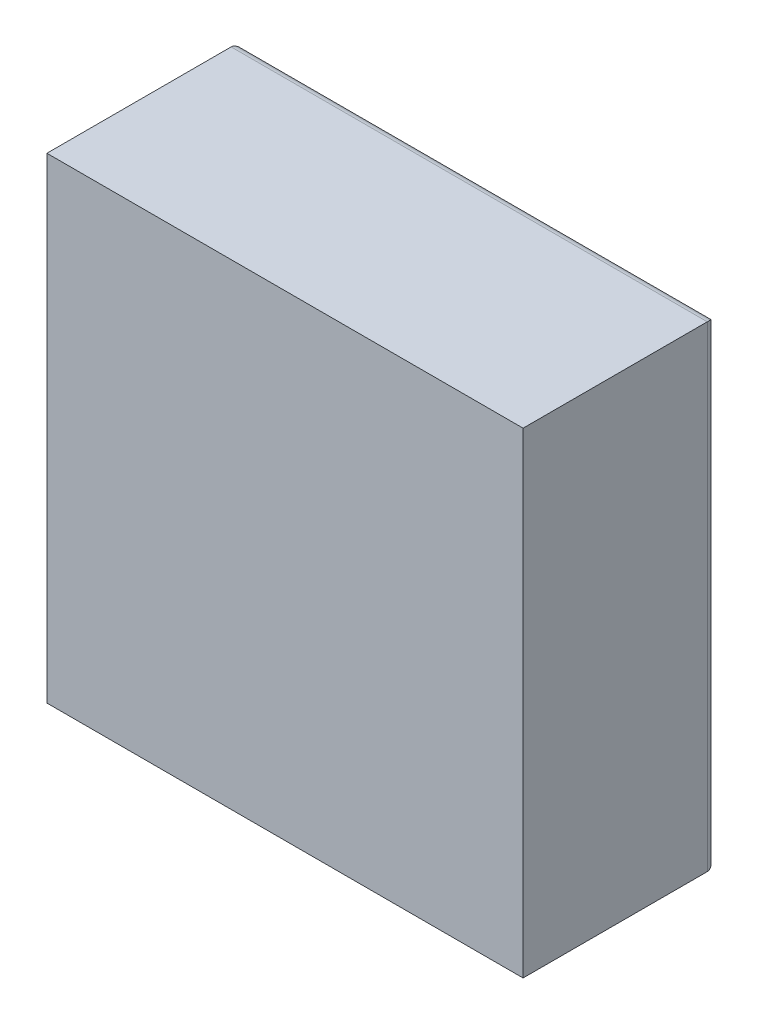
ISO-10303-21;
HEADER;
FILE_DESCRIPTION(('STEP AP214'),'2;1');
FILE_NAME('part.step','',(''),(''),'','','');
FILE_SCHEMA(('AUTOMOTIVE_DESIGN { 1 0 10303 214 1 1 1 1 }'));
ENDSEC;
DATA;
#1=APPLICATION_CONTEXT('core data for automotive mechanical design processes');
#2=APPLICATION_PROTOCOL_DEFINITION('international standard','automotive_design',2000,#1);
#3=PRODUCT_CONTEXT('',#1,'mechanical');
#4=PRODUCT('Part','Part','',(#3));
#5=PRODUCT_RELATED_PRODUCT_CATEGORY('part','',(#4));
#6=PRODUCT_DEFINITION_FORMATION('','',#4);
#7=PRODUCT_DEFINITION_CONTEXT('part definition',#1,'design');
#8=PRODUCT_DEFINITION('design','',#6,#7);
#9=PRODUCT_DEFINITION_SHAPE('','',#8);
#10=(LENGTH_UNIT() NAMED_UNIT(*) SI_UNIT(.MILLI.,.METRE.));
#11=(NAMED_UNIT(*) PLANE_ANGLE_UNIT() SI_UNIT($,.RADIAN.));
#12=(NAMED_UNIT(*) SI_UNIT($,.STERADIAN.) SOLID_ANGLE_UNIT());
#13=UNCERTAINTY_MEASURE_WITH_UNIT(LENGTH_MEASURE(1.E-05),#10,'distance_accuracy_value','');
#14=(GEOMETRIC_REPRESENTATION_CONTEXT(3) GLOBAL_UNCERTAINTY_ASSIGNED_CONTEXT((#13)) GLOBAL_UNIT_ASSIGNED_CONTEXT((#10,
#11,#12)) REPRESENTATION_CONTEXT('',''));
#15=CARTESIAN_POINT('',(0.,0.,0.));
#16=DIRECTION('',(0.,0.,1.));
#17=DIRECTION('',(1.,0.,0.));
#18=AXIS2_PLACEMENT_3D('',#15,#16,#17);
#19=CARTESIAN_POINT('',(-252.,252.,205.));
#20=DIRECTION('',(1.,0.,0.));
#21=DIRECTION('',(0.,0.,-1.));
#22=AXIS2_PLACEMENT_3D('',#19,#20,#21);
#23=PLANE('',#22);
#24=DIRECTION('',(0.,0.,-1.));
#25=VECTOR('',#24,1.);
#26=CARTESIAN_POINT('',(-252.,252.,205.));
#27=LINE('',#26,#25);
#28=CARTESIAN_POINT('',(-252.,252.,205.));
#29=VERTEX_POINT('',#28);
#30=CARTESIAN_POINT('',(-252.,252.,10.0000000000001));
#31=VERTEX_POINT('',#30);
#32=EDGE_CURVE('E391',#29,#31,#27,.T.);
#33=ORIENTED_EDGE('',*,*,#32,.T.);
#34=DIRECTION('',(0.,-1.,0.));
#35=VECTOR('',#34,1.);
#36=CARTESIAN_POINT('',(-252.,-252.,10.));
#37=LINE('',#36,#35);
#38=CARTESIAN_POINT('',(-252.,-252.,10.0000000000001));
#39=VERTEX_POINT('',#38);
#40=EDGE_CURVE('E149',#31,#39,#37,.T.);
#41=ORIENTED_EDGE('',*,*,#40,.T.);
#42=DIRECTION('',(0.,0.,-1.));
#43=VECTOR('',#42,1.);
#44=CARTESIAN_POINT('',(-252.,-252.,205.));
#45=LINE('',#44,#43);
#46=CARTESIAN_POINT('',(-252.,-252.,205.));
#47=VERTEX_POINT('',#46);
#48=EDGE_CURVE('E130',#47,#39,#45,.T.);
#49=ORIENTED_EDGE('',*,*,#48,.F.);
#50=DIRECTION('',(0.,-1.,0.));
#51=VECTOR('',#50,1.);
#52=CARTESIAN_POINT('',(-252.,252.,205.));
#53=LINE('',#52,#51);
#54=EDGE_CURVE('E137',#29,#47,#53,.T.);
#55=ORIENTED_EDGE('',*,*,#54,.F.);
#56=EDGE_LOOP('',(#33,#41,#49,#55));
#57=FACE_BOUND('',#56,.T.);
#58=ADVANCED_FACE('F37',(#57),#23,.F.);
#59=CARTESIAN_POINT('',(252.,-252.,205.));
#60=DIRECTION('',(0.,1.,0.));
#61=DIRECTION('',(0.,0.,1.));
#62=AXIS2_PLACEMENT_3D('',#59,#60,#61);
#63=PLANE('',#62);
#64=ORIENTED_EDGE('',*,*,#48,.T.);
#65=DIRECTION('',(1.,0.,0.));
#66=VECTOR('',#65,1.);
#67=CARTESIAN_POINT('',(252.,-252.,10.));
#68=LINE('',#67,#66);
#69=CARTESIAN_POINT('',(252.,-252.,10.0000000000001));
#70=VERTEX_POINT('',#69);
#71=EDGE_CURVE('E150',#39,#70,#68,.T.);
#72=ORIENTED_EDGE('',*,*,#71,.T.);
#73=DIRECTION('',(0.,0.,-1.));
#74=VECTOR('',#73,1.);
#75=CARTESIAN_POINT('',(252.,-252.,205.));
#76=LINE('',#75,#74);
#77=CARTESIAN_POINT('',(252.,-252.,205.));
#78=VERTEX_POINT('',#77);
#79=EDGE_CURVE('E133',#78,#70,#76,.T.);
#80=ORIENTED_EDGE('',*,*,#79,.F.);
#81=DIRECTION('',(1.,0.,0.));
#82=VECTOR('',#81,1.);
#83=CARTESIAN_POINT('',(252.,-252.,205.));
#84=LINE('',#83,#82);
#85=EDGE_CURVE('E125',#47,#78,#84,.T.);
#86=ORIENTED_EDGE('',*,*,#85,.F.);
#87=EDGE_LOOP('',(#64,#72,#80,#86));
#88=FACE_BOUND('',#87,.T.);
#89=ADVANCED_FACE('F127',(#88),#63,.F.);
#90=CARTESIAN_POINT('',(252.,252.,205.));
#91=DIRECTION('',(-1.,0.,0.));
#92=DIRECTION('',(0.,0.,1.));
#93=AXIS2_PLACEMENT_3D('',#90,#91,#92);
#94=PLANE('',#93);
#95=ORIENTED_EDGE('',*,*,#79,.T.);
#96=DIRECTION('',(0.,1.,0.));
#97=VECTOR('',#96,1.);
#98=CARTESIAN_POINT('',(252.,252.,10.));
#99=LINE('',#98,#97);
#100=CARTESIAN_POINT('',(252.,252.,10.0000000000001));
#101=VERTEX_POINT('',#100);
#102=EDGE_CURVE('E162',#70,#101,#99,.T.);
#103=ORIENTED_EDGE('',*,*,#102,.T.);
#104=DIRECTION('',(0.,0.,-1.));
#105=VECTOR('',#104,1.);
#106=CARTESIAN_POINT('',(252.,252.,205.));
#107=LINE('',#106,#105);
#108=CARTESIAN_POINT('',(252.,252.,205.));
#109=VERTEX_POINT('',#108);
#110=EDGE_CURVE('E154',#109,#101,#107,.T.);
#111=ORIENTED_EDGE('',*,*,#110,.F.);
#112=DIRECTION('',(0.,1.,0.));
#113=VECTOR('',#112,1.);
#114=CARTESIAN_POINT('',(252.,252.,205.));
#115=LINE('',#114,#113);
#116=EDGE_CURVE('E136',#78,#109,#115,.T.);
#117=ORIENTED_EDGE('',*,*,#116,.F.);
#118=EDGE_LOOP('',(#95,#103,#111,#117));
#119=FACE_BOUND('',#118,.T.);
#120=ADVANCED_FACE('F294',(#119),#94,.F.);
#121=CARTESIAN_POINT('',(252.,252.,205.));
#122=DIRECTION('',(0.,-1.,0.));
#123=DIRECTION('',(0.,0.,-1.));
#124=AXIS2_PLACEMENT_3D('',#121,#122,#123);
#125=PLANE('',#124);
#126=ORIENTED_EDGE('',*,*,#110,.T.);
#127=DIRECTION('',(-1.,0.,0.));
#128=VECTOR('',#127,1.);
#129=CARTESIAN_POINT('',(-252.,252.,10.));
#130=LINE('',#129,#128);
#131=EDGE_CURVE('E167',#101,#31,#130,.T.);
#132=ORIENTED_EDGE('',*,*,#131,.T.);
#133=ORIENTED_EDGE('',*,*,#32,.F.);
#134=DIRECTION('',(-1.,0.,0.));
#135=VECTOR('',#134,1.);
#136=CARTESIAN_POINT('',(252.,252.,205.));
#137=LINE('',#136,#135);
#138=EDGE_CURVE('E142',#109,#29,#137,.T.);
#139=ORIENTED_EDGE('',*,*,#138,.F.);
#140=EDGE_LOOP('',(#126,#132,#133,#139));
#141=FACE_BOUND('',#140,.T.);
#142=ADVANCED_FACE('F299',(#141),#125,.F.);
#143=CARTESIAN_POINT('',(0.,0.,205.));
#144=DIRECTION('',(0.,0.,-1.));
#145=DIRECTION('',(-1.,0.,0.));
#146=AXIS2_PLACEMENT_3D('',#143,#144,#145);
#147=PLANE('',#146);
#148=ORIENTED_EDGE('',*,*,#54,.T.);
#149=ORIENTED_EDGE('',*,*,#85,.T.);
#150=ORIENTED_EDGE('',*,*,#116,.T.);
#151=ORIENTED_EDGE('',*,*,#138,.T.);
#152=EDGE_LOOP('',(#148,#149,#150,#151));
#153=FACE_BOUND('',#152,.T.);
#154=ADVANCED_FACE('F140',(#153),#147,.F.);
#155=CARTESIAN_POINT('',(-250.,250.,200.));
#156=DIRECTION('',(-1.,0.,0.));
#157=DIRECTION('',(0.,0.,1.));
#158=AXIS2_PLACEMENT_3D('',#155,#156,#157);
#159=PLANE('',#158);
#160=DIRECTION('',(0.,0.,-1.));
#161=VECTOR('',#160,1.);
#162=CARTESIAN_POINT('',(-250.,250.,200.));
#163=LINE('',#162,#161);
#164=CARTESIAN_POINT('',(-250.,250.,190.));
#165=VERTEX_POINT('',#164);
#166=CARTESIAN_POINT('',(-250.,250.,4.00000000000009));
#167=VERTEX_POINT('',#166);
#168=EDGE_CURVE('E214',#165,#167,#163,.T.);
#169=ORIENTED_EDGE('',*,*,#168,.F.);
#170=DIRECTION('',(0.,1.,0.));
#171=VECTOR('',#170,1.);
#172=CARTESIAN_POINT('',(-250.,250.,190.));
#173=LINE('',#172,#171);
#174=CARTESIAN_POINT('',(-250.,-240.,190.));
#175=VERTEX_POINT('',#174);
#176=EDGE_CURVE('E61',#165,#175,#173,.F.);
#177=ORIENTED_EDGE('',*,*,#176,.T.);
#178=DIRECTION('',(0.,0.,-1.));
#179=VECTOR('',#178,1.);
#180=CARTESIAN_POINT('',(-250.,-240.,0.));
#181=LINE('',#180,#179);
#182=CARTESIAN_POINT('',(-250.,-240.,4.00000000000009));
#183=VERTEX_POINT('',#182);
#184=EDGE_CURVE('E173',#175,#183,#181,.T.);
#185=ORIENTED_EDGE('',*,*,#184,.T.);
#186=DIRECTION('',(0.,1.,0.));
#187=VECTOR('',#186,1.);
#188=CARTESIAN_POINT('',(-250.,0.,4.00000000000009));
#189=LINE('',#188,#187);
#190=EDGE_CURVE('E175',#183,#167,#189,.T.);
#191=ORIENTED_EDGE('',*,*,#190,.T.);
#192=EDGE_LOOP('',(#169,#177,#185,#191));
#193=FACE_BOUND('',#192,.T.);
#194=ADVANCED_FACE('F272',(#193),#159,.F.);
#195=CARTESIAN_POINT('',(250.,-250.,200.));
#196=DIRECTION('',(0.,-1.,0.));
#197=DIRECTION('',(0.,0.,-1.));
#198=AXIS2_PLACEMENT_3D('',#195,#196,#197);
#199=PLANE('',#198);
#200=DIRECTION('',(0.,0.,-1.));
#201=VECTOR('',#200,1.);
#202=CARTESIAN_POINT('',(-240.,-250.,200.));
#203=LINE('',#202,#201);
#204=CARTESIAN_POINT('',(-240.,-250.,4.00000000000003));
#205=VERTEX_POINT('',#204);
#206=CARTESIAN_POINT('',(-240.,-250.,190.));
#207=VERTEX_POINT('',#206);
#208=EDGE_CURVE('E152',#205,#207,#203,.F.);
#209=ORIENTED_EDGE('',*,*,#208,.T.);
#210=DIRECTION('',(-1.,0.,0.));
#211=VECTOR('',#210,1.);
#212=CARTESIAN_POINT('',(250.,-250.,190.));
#213=LINE('',#212,#211);
#214=CARTESIAN_POINT('',(250.,-250.,190.));
#215=VERTEX_POINT('',#214);
#216=EDGE_CURVE('E11',#207,#215,#213,.F.);
#217=ORIENTED_EDGE('',*,*,#216,.T.);
#218=DIRECTION('',(0.,0.,-1.));
#219=VECTOR('',#218,1.);
#220=CARTESIAN_POINT('',(250.,-250.,200.));
#221=LINE('',#220,#219);
#222=CARTESIAN_POINT('',(250.,-250.,4.00000000000003));
#223=VERTEX_POINT('',#222);
#224=EDGE_CURVE('E146',#215,#223,#221,.T.);
#225=ORIENTED_EDGE('',*,*,#224,.T.);
#226=DIRECTION('',(-1.,0.,0.));
#227=VECTOR('',#226,1.);
#228=CARTESIAN_POINT('',(0.,-250.,4.00000000000002));
#229=LINE('',#228,#227);
#230=EDGE_CURVE('E159',#223,#205,#229,.T.);
#231=ORIENTED_EDGE('',*,*,#230,.T.);
#232=EDGE_LOOP('',(#209,#217,#225,#231));
#233=FACE_BOUND('',#232,.T.);
#234=ADVANCED_FACE('F256',(#233),#199,.F.);
#235=CARTESIAN_POINT('',(250.,250.,200.));
#236=DIRECTION('',(1.,0.,0.));
#237=DIRECTION('',(0.,0.,-1.));
#238=AXIS2_PLACEMENT_3D('',#235,#236,#237);
#239=PLANE('',#238);
#240=ORIENTED_EDGE('',*,*,#224,.F.);
#241=DIRECTION('',(0.,-1.,0.));
#242=VECTOR('',#241,1.);
#243=CARTESIAN_POINT('',(250.,250.,190.));
#244=LINE('',#243,#242);
#245=CARTESIAN_POINT('',(250.,250.,190.));
#246=VERTEX_POINT('',#245);
#247=EDGE_CURVE('E223',#215,#246,#244,.F.);
#248=ORIENTED_EDGE('',*,*,#247,.T.);
#249=DIRECTION('',(0.,0.,-1.));
#250=VECTOR('',#249,1.);
#251=CARTESIAN_POINT('',(250.,250.,200.));
#252=LINE('',#251,#250);
#253=CARTESIAN_POINT('',(250.,250.,4.00000000000003));
#254=VERTEX_POINT('',#253);
#255=EDGE_CURVE('E263',#246,#254,#252,.T.);
#256=ORIENTED_EDGE('',*,*,#255,.T.);
#257=DIRECTION('',(0.,-1.,0.));
#258=VECTOR('',#257,1.);
#259=CARTESIAN_POINT('',(250.,0.,4.00000000000002));
#260=LINE('',#259,#258);
#261=EDGE_CURVE('E164',#254,#223,#260,.T.);
#262=ORIENTED_EDGE('',*,*,#261,.T.);
#263=EDGE_LOOP('',(#240,#248,#256,#262));
#264=FACE_BOUND('',#263,.T.);
#265=ADVANCED_FACE('F259',(#264),#239,.F.);
#266=CARTESIAN_POINT('',(250.,250.,200.));
#267=DIRECTION('',(0.,1.,0.));
#268=DIRECTION('',(0.,0.,1.));
#269=AXIS2_PLACEMENT_3D('',#266,#267,#268);
#270=PLANE('',#269);
#271=ORIENTED_EDGE('',*,*,#255,.F.);
#272=DIRECTION('',(1.,0.,0.));
#273=VECTOR('',#272,1.);
#274=CARTESIAN_POINT('',(250.,250.,190.));
#275=LINE('',#274,#273);
#276=EDGE_CURVE('E226',#246,#165,#275,.F.);
#277=ORIENTED_EDGE('',*,*,#276,.T.);
#278=ORIENTED_EDGE('',*,*,#168,.T.);
#279=DIRECTION('',(1.,0.,0.));
#280=VECTOR('',#279,1.);
#281=CARTESIAN_POINT('',(0.,250.,4.00000000000002));
#282=LINE('',#281,#280);
#283=EDGE_CURVE('E169',#167,#254,#282,.T.);
#284=ORIENTED_EDGE('',*,*,#283,.T.);
#285=EDGE_LOOP('',(#271,#277,#278,#284));
#286=FACE_BOUND('',#285,.T.);
#287=ADVANCED_FACE('F271',(#286),#270,.F.);
#288=CARTESIAN_POINT('',(0.,0.,200.));
#289=DIRECTION('',(0.,0.,-1.));
#290=DIRECTION('',(-1.,0.,0.));
#291=AXIS2_PLACEMENT_3D('',#288,#289,#290);
#292=PLANE('',#291);
#293=DIRECTION('',(1.,0.,0.));
#294=VECTOR('',#293,1.);
#295=CARTESIAN_POINT('',(0.,240.,200.));
#296=LINE('',#295,#294);
#297=CARTESIAN_POINT('',(-240.,240.,200.));
#298=VERTEX_POINT('',#297);
#299=CARTESIAN_POINT('',(240.,240.,200.));
#300=VERTEX_POINT('',#299);
#301=EDGE_CURVE('E218',#298,#300,#296,.T.);
#302=ORIENTED_EDGE('',*,*,#301,.T.);
#303=DIRECTION('',(0.,-1.,0.));
#304=VECTOR('',#303,1.);
#305=CARTESIAN_POINT('',(240.,0.,200.));
#306=LINE('',#305,#304);
#307=CARTESIAN_POINT('',(240.,-240.,200.));
#308=VERTEX_POINT('',#307);
#309=EDGE_CURVE('E220',#300,#308,#306,.T.);
#310=ORIENTED_EDGE('',*,*,#309,.T.);
#311=DIRECTION('',(-1.,0.,0.));
#312=VECTOR('',#311,1.);
#313=CARTESIAN_POINT('',(0.,-240.,200.));
#314=LINE('',#313,#312);
#315=CARTESIAN_POINT('',(-240.,-240.,200.));
#316=VERTEX_POINT('',#315);
#317=EDGE_CURVE('E178',#308,#316,#314,.T.);
#318=ORIENTED_EDGE('',*,*,#317,.T.);
#319=DIRECTION('',(0.,1.,0.));
#320=VECTOR('',#319,1.);
#321=CARTESIAN_POINT('',(-240.,0.,200.));
#322=LINE('',#321,#320);
#323=EDGE_CURVE('E216',#316,#298,#322,.T.);
#324=ORIENTED_EDGE('',*,*,#323,.T.);
#325=EDGE_LOOP('',(#302,#310,#318,#324));
#326=FACE_BOUND('',#325,.T.);
#327=ADVANCED_FACE('F277',(#326),#292,.T.);
#328=CARTESIAN_POINT('',(252.,242.,10.));
#329=DIRECTION('',(1.,0.,0.));
#330=DIRECTION('',(0.,0.,-1.));
#331=AXIS2_PLACEMENT_3D('',#328,#329,#330);
#332=CYLINDRICAL_SURFACE('',#331,10.);
#333=CARTESIAN_POINT('',(-242.,242.,10.));
#334=DIRECTION('',(0.707106781186547,0.707106781186547,0.));
#335=DIRECTION('',(-0.707106781186547,0.707106781186547,0.));
#336=AXIS2_PLACEMENT_3D('',#333,#334,#335);
#337=ELLIPSE('',#336,14.1421356237309,10.);
#338=EDGE_CURVE('E211',#31,#167,#337,.F.);
#339=ORIENTED_EDGE('',*,*,#338,.F.);
#340=ORIENTED_EDGE('',*,*,#131,.F.);
#341=CARTESIAN_POINT('',(242.,242.,10.));
#342=DIRECTION('',(0.707106781186547,-0.707106781186547,0.));
#343=DIRECTION('',(0.707106781186547,0.707106781186547,0.));
#344=AXIS2_PLACEMENT_3D('',#341,#342,#343);
#345=ELLIPSE('',#344,14.1421356237309,10.);
#346=EDGE_CURVE('E210',#254,#101,#345,.T.);
#347=ORIENTED_EDGE('',*,*,#346,.F.);
#348=ORIENTED_EDGE('',*,*,#283,.F.);
#349=EDGE_LOOP('',(#339,#340,#347,#348));
#350=FACE_BOUND('',#349,.T.);
#351=ADVANCED_FACE('F279',(#350),#332,.T.);
#352=CARTESIAN_POINT('',(242.,252.,10.));
#353=DIRECTION('',(0.,-1.,0.));
#354=DIRECTION('',(0.,0.,-1.));
#355=AXIS2_PLACEMENT_3D('',#352,#353,#354);
#356=CYLINDRICAL_SURFACE('',#355,10.);
#357=ORIENTED_EDGE('',*,*,#346,.T.);
#358=ORIENTED_EDGE('',*,*,#102,.F.);
#359=CARTESIAN_POINT('',(242.,-242.,10.));
#360=DIRECTION('',(-0.707106781186547,-0.707106781186547,0.));
#361=DIRECTION('',(0.707106781186547,-0.707106781186547,0.));
#362=AXIS2_PLACEMENT_3D('',#359,#360,#361);
#363=ELLIPSE('',#362,14.1421356237309,10.);
#364=EDGE_CURVE('E189',#223,#70,#363,.T.);
#365=ORIENTED_EDGE('',*,*,#364,.F.);
#366=ORIENTED_EDGE('',*,*,#261,.F.);
#367=EDGE_LOOP('',(#357,#358,#365,#366));
#368=FACE_BOUND('',#367,.T.);
#369=ADVANCED_FACE('F285',(#368),#356,.T.);
#370=CARTESIAN_POINT('',(-240.,-240.,200.));
#371=DIRECTION('',(0.,0.,1.));
#372=DIRECTION('',(1.,0.,0.));
#373=AXIS2_PLACEMENT_3D('',#370,#371,#372);
#374=CYLINDRICAL_SURFACE('',#373,10.);
#375=ORIENTED_EDGE('',*,*,#184,.F.);
#376=CARTESIAN_POINT('',(-240.,-240.,190.));
#377=DIRECTION('',(0.,0.,1.));
#378=DIRECTION('',(1.,0.,0.));
#379=AXIS2_PLACEMENT_3D('',#376,#377,#378);
#380=CIRCLE('',#379,10.);
#381=EDGE_CURVE('E46',#175,#207,#380,.T.);
#382=ORIENTED_EDGE('',*,*,#381,.T.);
#383=ORIENTED_EDGE('',*,*,#208,.F.);
#384=CARTESIAN_POINT('',(-247.071067811866,-247.071067811866,1.38116764013469));
#385=CARTESIAN_POINT('',(-246.966918346854,-247.175211939752,1.44244311451459));
#386=CARTESIAN_POINT('',(-246.860788737627,-247.27674543071,1.50472379168674));
#387=CARTESIAN_POINT('',(-246.644690831391,-247.474594223981,1.63085520932467));
#388=CARTESIAN_POINT('',(-246.534722930708,-247.570910062442,1.69470578748867));
#389=CARTESIAN_POINT('',(-246.199141075513,-247.852125980065,1.8880117843424));
#390=CARTESIAN_POINT('',(-245.96791455477,-248.029229032233,2.01918241420353));
#391=CARTESIAN_POINT('',(-245.486926938814,-248.365484617161,2.28460502994437));
#392=CARTESIAN_POINT('',(-245.236905701939,-248.524253221715,2.41886974671778));
#393=CARTESIAN_POINT('',(-244.722288931677,-248.819749841743,2.68356057597528));
#394=CARTESIAN_POINT('',(-244.457698895507,-248.956486095206,2.81398810821852));
#395=CARTESIAN_POINT('',(-243.995815537435,-249.169359634111,3.02750491569374));
#396=CARTESIAN_POINT('',(-243.802308869037,-249.251331999173,3.11300210503876));
#397=CARTESIAN_POINT('',(-243.407874511861,-249.403781391489,3.27716132264722));
#398=CARTESIAN_POINT('',(-243.206944668773,-249.474255048998,3.35582134410655));
#399=CARTESIAN_POINT('',(-242.799650849333,-249.602453633895,3.50291326899165));
#400=CARTESIAN_POINT('',(-242.593353875692,-249.660289887195,3.57143261522592));
#401=CARTESIAN_POINT('',(-242.174037931277,-249.763200413491,3.69609131250375));
#402=CARTESIAN_POINT('',(-241.961024605142,-249.808285101454,3.75224075844957));
#403=CARTESIAN_POINT('',(-241.604110219261,-249.871542024487,3.83230592753221));
#404=CARTESIAN_POINT('',(-241.461881648453,-249.893623960132,3.86064536400664));
#405=CARTESIAN_POINT('',(-241.17537635608,-249.931735310815,3.90996364578834));
#406=CARTESIAN_POINT('',(-241.031100271577,-249.9477665674,3.93094473050038));
#407=CARTESIAN_POINT('',(-240.739499563558,-249.973703710561,3.96505655606542));
#408=CARTESIAN_POINT('',(-240.592158836674,-249.983542727795,3.97810154730636));
#409=CARTESIAN_POINT('',(-240.296554161721,-249.996702250254,3.99560350055092));
#410=CARTESIAN_POINT('',(-240.148289524823,-250.000017104846,4.00005301787904));
#411=CARTESIAN_POINT('',(-240.,-250.,3.99999999999998));
#412=B_SPLINE_CURVE_WITH_KNOTS('',3,(#384,#385,#386,#387,#388,#389,#390,#391,#392,#393,#394,
#395,#396,#397,#398,#399,#400,#401,#402,#403,#404,#405,#406,#407,#408,#409,#410,#411),
.UNSPECIFIED.,.F.,.F.,(4,2,2,2,2,2,2,2,2,2,2,2,2,4),(0.,0.478487925689646,0.956926589937154,
1.91410460508315,2.88864694167493,3.8628240429733,4.54302523702008,5.22342541013594,
5.89756575390537,6.57115388626491,7.01095796861859,7.45062808676421,7.89496817046119,
8.33969293186697),.UNSPECIFIED.);
#413=CARTESIAN_POINT('',(-247.071067811866,-247.071067811866,1.38116764013469));
#414=VERTEX_POINT('',#413);
#415=EDGE_CURVE('E182',#414,#205,#412,.T.);
#416=ORIENTED_EDGE('',*,*,#415,.F.);
#417=CARTESIAN_POINT('',(-250.,-240.,4.00000000000009));
#418=CARTESIAN_POINT('',(-250.000001710534,-240.096330825067,4.00000665346943));
#419=CARTESIAN_POINT('',(-249.998607656503,-240.192646223779,3.99814307657426));
#420=CARTESIAN_POINT('',(-249.993047509676,-240.38504202961,3.99073853012752));
#421=CARTESIAN_POINT('',(-249.988881812723,-240.481122468319,3.98519808570016));
#422=CARTESIAN_POINT('',(-249.972279390347,-240.768339855311,3.96318638031184));
#423=CARTESIAN_POINT('',(-249.95573715231,-240.958863022758,3.94132421037804));
#424=CARTESIAN_POINT('',(-249.912384344122,-241.334116204282,3.88482179999929));
#425=CARTESIAN_POINT('',(-249.88571381755,-241.518889602307,3.85035605952703));
#426=CARTESIAN_POINT('',(-249.822604267573,-241.884373284232,3.77027630996427));
#427=CARTESIAN_POINT('',(-249.786159879603,-242.065081277542,3.72465617979776));
#428=CARTESIAN_POINT('',(-249.688217385682,-242.490532175467,3.60473750825069));
#429=CARTESIAN_POINT('',(-249.622477534666,-242.733094277932,3.52616402512296));
#430=CARTESIAN_POINT('',(-249.474600309488,-243.208422184536,3.35597636923927));
#431=CARTESIAN_POINT('',(-249.392456242286,-243.441183942974,3.2643568780108));
#432=CARTESIAN_POINT('',(-249.211977713448,-243.898778012295,3.07143768852858));
#433=CARTESIAN_POINT('',(-249.113510958341,-244.123525615195,2.97006199316476));
#434=CARTESIAN_POINT('',(-248.901550997103,-244.563104499156,2.76186040706933));
#435=CARTESIAN_POINT('',(-248.788060136506,-244.777937321048,2.65503536867555));
#436=CARTESIAN_POINT('',(-248.557250686276,-245.179003283001,2.44855943375733));
#437=CARTESIAN_POINT('',(-248.44118823998,-245.366073398898,2.34912436132429));
#438=CARTESIAN_POINT('',(-248.19705365797,-245.73207539048,2.15007431271981));
#439=CARTESIAN_POINT('',(-248.068982738461,-245.911008087594,2.05045935576692));
#440=CARTESIAN_POINT('',(-247.802610041253,-246.258320168165,1.85403538125471));
#441=CARTESIAN_POINT('',(-247.664461663489,-246.42680596123,1.75720674209919));
#442=CARTESIAN_POINT('',(-247.376502803631,-246.755355768251,1.56654956652355));
#443=CARTESIAN_POINT('',(-247.226690095202,-246.915418164642,1.47272160767905));
#444=CARTESIAN_POINT('',(-247.071067811866,-247.071067811866,1.38116764013469));
#445=B_SPLINE_CURVE_WITH_KNOTS('',3,(#417,#418,#419,#420,#421,#422,#423,#424,#425,#426,#427,
#428,#429,#430,#431,#432,#433,#434,#435,#436,#437,#438,#439,#440,#441,#442,#443,#444),
.UNSPECIFIED.,.F.,.F.,(4,2,2,2,2,2,2,2,2,2,2,2,2,4),(0.,0.288934621857526,0.577827987422747,
1.15438935141595,1.72325291350702,2.29242934820942,3.08110793981661,3.87010897785002,
4.66584906653943,5.46146507199292,6.18572621790337,6.90991409053673,7.62475407687323,
8.3397308385671),.UNSPECIFIED.);
#446=EDGE_CURVE('E205',#183,#414,#445,.T.);
#447=ORIENTED_EDGE('',*,*,#446,.F.);
#448=EDGE_LOOP('',(#375,#382,#383,#416,#447));
#449=FACE_BOUND('',#448,.T.);
#450=ADVANCED_FACE('F191',(#449),#374,.F.);
#451=CARTESIAN_POINT('',(-242.,252.,10.));
#452=DIRECTION('',(0.,1.,0.));
#453=DIRECTION('',(0.,0.,1.));
#454=AXIS2_PLACEMENT_3D('',#451,#452,#453);
#455=CYLINDRICAL_SURFACE('',#454,10.);
#456=ORIENTED_EDGE('',*,*,#190,.F.);
#457=ORIENTED_EDGE('',*,*,#446,.T.);
#458=CARTESIAN_POINT('',(-242.,-242.,10.));
#459=DIRECTION('',(-0.707106781186547,0.707106781186547,0.));
#460=DIRECTION('',(0.707106781186547,0.707106781186547,0.));
#461=AXIS2_PLACEMENT_3D('',#458,#459,#460);
#462=ELLIPSE('',#461,14.1421356237309,10.);
#463=EDGE_CURVE('E179',#39,#414,#462,.F.);
#464=ORIENTED_EDGE('',*,*,#463,.F.);
#465=ORIENTED_EDGE('',*,*,#40,.F.);
#466=ORIENTED_EDGE('',*,*,#338,.T.);
#467=EDGE_LOOP('',(#456,#457,#464,#465,#466));
#468=FACE_BOUND('',#467,.T.);
#469=ADVANCED_FACE('F199',(#468),#455,.T.);
#470=CARTESIAN_POINT('',(252.,-242.,10.));
#471=DIRECTION('',(-1.,0.,0.));
#472=DIRECTION('',(0.,0.,1.));
#473=AXIS2_PLACEMENT_3D('',#470,#471,#472);
#474=CYLINDRICAL_SURFACE('',#473,10.);
#475=ORIENTED_EDGE('',*,*,#230,.F.);
#476=ORIENTED_EDGE('',*,*,#364,.T.);
#477=ORIENTED_EDGE('',*,*,#71,.F.);
#478=ORIENTED_EDGE('',*,*,#463,.T.);
#479=ORIENTED_EDGE('',*,*,#415,.T.);
#480=EDGE_LOOP('',(#475,#476,#477,#478,#479));
#481=FACE_BOUND('',#480,.T.);
#482=ADVANCED_FACE('F196',(#481),#474,.T.);
#483=CARTESIAN_POINT('',(-240.,0.,190.));
#484=DIRECTION('',(0.,1.,0.));
#485=DIRECTION('',(0.,0.,1.));
#486=AXIS2_PLACEMENT_3D('',#483,#484,#485);
#487=CYLINDRICAL_SURFACE('',#486,10.);
#488=CARTESIAN_POINT('',(-240.,-240.,190.));
#489=DIRECTION('',(0.,1.,0.));
#490=DIRECTION('',(0.,0.,1.));
#491=AXIS2_PLACEMENT_3D('',#488,#489,#490);
#492=CIRCLE('',#491,10.);
#493=EDGE_CURVE('E41',#175,#316,#492,.T.);
#494=ORIENTED_EDGE('',*,*,#493,.F.);
#495=ORIENTED_EDGE('',*,*,#176,.F.);
#496=CARTESIAN_POINT('',(-240.,240.,190.));
#497=DIRECTION('',(0.707106781186547,0.707106781186547,0.));
#498=DIRECTION('',(0.707106781186547,-0.707106781186547,0.));
#499=AXIS2_PLACEMENT_3D('',#496,#497,#498);
#500=ELLIPSE('',#499,14.1421356237309,10.);
#501=EDGE_CURVE('E236',#298,#165,#500,.F.);
#502=ORIENTED_EDGE('',*,*,#501,.F.);
#503=ORIENTED_EDGE('',*,*,#323,.F.);
#504=EDGE_LOOP('',(#494,#495,#502,#503));
#505=FACE_BOUND('',#504,.T.);
#506=ADVANCED_FACE('F39',(#505),#487,.F.);
#507=CARTESIAN_POINT('',(-240.,-240.,190.));
#508=DIRECTION('',(0.,0.,-1.));
#509=DIRECTION('',(-1.,0.,0.));
#510=AXIS2_PLACEMENT_3D('',#507,#508,#509);
#511=SPHERICAL_SURFACE('',#510,10.);
#512=ORIENTED_EDGE('',*,*,#381,.F.);
#513=ORIENTED_EDGE('',*,*,#493,.T.);
#514=CARTESIAN_POINT('',(-240.,-240.,190.));
#515=DIRECTION('',(-1.,0.,0.));
#516=DIRECTION('',(0.,0.,1.));
#517=AXIS2_PLACEMENT_3D('',#514,#515,#516);
#518=CIRCLE('',#517,10.);
#519=EDGE_CURVE('E234',#207,#316,#518,.T.);
#520=ORIENTED_EDGE('',*,*,#519,.F.);
#521=EDGE_LOOP('',(#512,#513,#520));
#522=FACE_BOUND('',#521,.T.);
#523=ADVANCED_FACE('F246',(#522),#511,.F.);
#524=CARTESIAN_POINT('',(0.,240.,190.));
#525=DIRECTION('',(1.,0.,0.));
#526=DIRECTION('',(0.,0.,-1.));
#527=AXIS2_PLACEMENT_3D('',#524,#525,#526);
#528=CYLINDRICAL_SURFACE('',#527,10.);
#529=ORIENTED_EDGE('',*,*,#501,.T.);
#530=ORIENTED_EDGE('',*,*,#276,.F.);
#531=CARTESIAN_POINT('',(240.,240.,190.));
#532=DIRECTION('',(0.707106781186547,-0.707106781186547,0.));
#533=DIRECTION('',(-0.707106781186547,-0.707106781186547,0.));
#534=AXIS2_PLACEMENT_3D('',#531,#532,#533);
#535=ELLIPSE('',#534,14.1421356237309,10.);
#536=EDGE_CURVE('E232',#300,#246,#535,.F.);
#537=ORIENTED_EDGE('',*,*,#536,.F.);
#538=ORIENTED_EDGE('',*,*,#301,.F.);
#539=EDGE_LOOP('',(#529,#530,#537,#538));
#540=FACE_BOUND('',#539,.T.);
#541=ADVANCED_FACE('F269',(#540),#528,.F.);
#542=CARTESIAN_POINT('',(0.,-240.,190.));
#543=DIRECTION('',(-1.,0.,0.));
#544=DIRECTION('',(0.,0.,1.));
#545=AXIS2_PLACEMENT_3D('',#542,#543,#544);
#546=CYLINDRICAL_SURFACE('',#545,10.);
#547=ORIENTED_EDGE('',*,*,#519,.T.);
#548=ORIENTED_EDGE('',*,*,#317,.F.);
#549=CARTESIAN_POINT('',(240.,-240.,190.));
#550=DIRECTION('',(-0.707106781186547,-0.707106781186547,0.));
#551=DIRECTION('',(0.707106781186547,-0.707106781186547,0.));
#552=AXIS2_PLACEMENT_3D('',#549,#550,#551);
#553=ELLIPSE('',#552,14.1421356237309,10.);
#554=EDGE_CURVE('E230',#215,#308,#553,.T.);
#555=ORIENTED_EDGE('',*,*,#554,.F.);
#556=ORIENTED_EDGE('',*,*,#216,.F.);
#557=EDGE_LOOP('',(#547,#548,#555,#556));
#558=FACE_BOUND('',#557,.T.);
#559=ADVANCED_FACE('F252',(#558),#546,.F.);
#560=CARTESIAN_POINT('',(240.,0.,190.));
#561=DIRECTION('',(0.,-1.,0.));
#562=DIRECTION('',(0.,0.,-1.));
#563=AXIS2_PLACEMENT_3D('',#560,#561,#562);
#564=CYLINDRICAL_SURFACE('',#563,10.);
#565=ORIENTED_EDGE('',*,*,#536,.T.);
#566=ORIENTED_EDGE('',*,*,#247,.F.);
#567=ORIENTED_EDGE('',*,*,#554,.T.);
#568=ORIENTED_EDGE('',*,*,#309,.F.);
#569=EDGE_LOOP('',(#565,#566,#567,#568));
#570=FACE_BOUND('',#569,.T.);
#571=ADVANCED_FACE('F266',(#570),#564,.F.);
#572=CLOSED_SHELL('',(#58,#89,#120,#142,#154,#194,#234,#265,#287,#327,#351,#369,#450,#469,#482,
#506,#523,#541,#559,#571));
#573=MANIFOLD_SOLID_BREP('B2',#572);
#574=ADVANCED_BREP_SHAPE_REPRESENTATION('',(#18,#573),#14);
#575=SHAPE_DEFINITION_REPRESENTATION(#9,#574);
ENDSEC;
END-ISO-10303-21;
